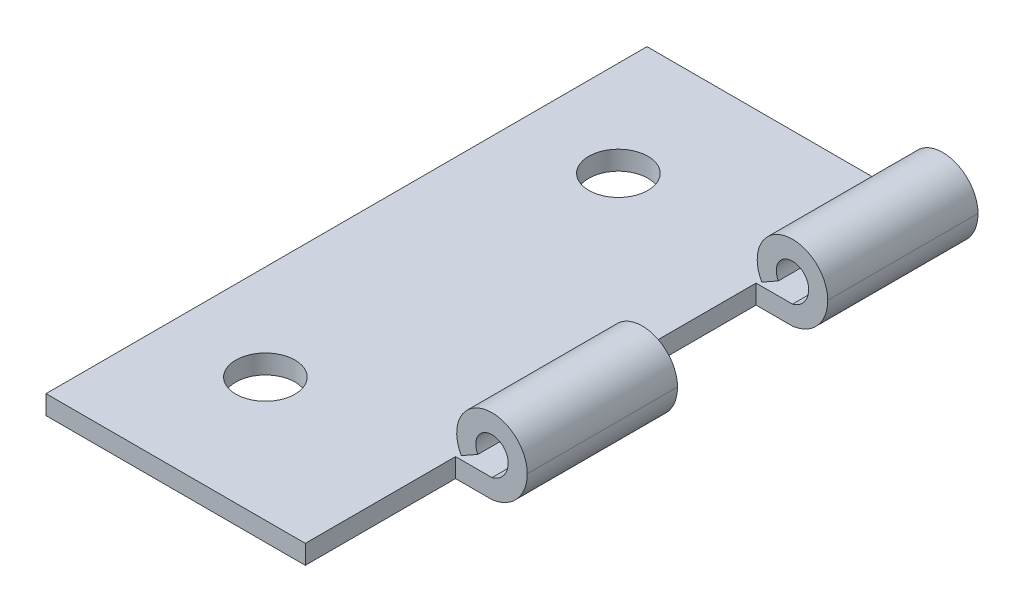
ISO-10303-21;
HEADER;
FILE_DESCRIPTION(('STEP AP214'),'2;1');
FILE_NAME('part.step','',(''),(''),'','','');
FILE_SCHEMA(('AUTOMOTIVE_DESIGN { 1 0 10303 214 1 1 1 1 }'));
ENDSEC;
DATA;
#1=APPLICATION_CONTEXT('core data for automotive mechanical design processes');
#2=APPLICATION_PROTOCOL_DEFINITION('international standard','automotive_design',2000,#1);
#3=PRODUCT_CONTEXT('',#1,'mechanical');
#4=PRODUCT('Part','Part','',(#3));
#5=PRODUCT_RELATED_PRODUCT_CATEGORY('part','',(#4));
#6=PRODUCT_DEFINITION_FORMATION('','',#4);
#7=PRODUCT_DEFINITION_CONTEXT('part definition',#1,'design');
#8=PRODUCT_DEFINITION('design','',#6,#7);
#9=PRODUCT_DEFINITION_SHAPE('','',#8);
#10=(LENGTH_UNIT() NAMED_UNIT(*) SI_UNIT(.MILLI.,.METRE.));
#11=(NAMED_UNIT(*) PLANE_ANGLE_UNIT() SI_UNIT($,.RADIAN.));
#12=(NAMED_UNIT(*) SI_UNIT($,.STERADIAN.) SOLID_ANGLE_UNIT());
#13=UNCERTAINTY_MEASURE_WITH_UNIT(LENGTH_MEASURE(1.E-05),#10,'distance_accuracy_value','');
#14=(GEOMETRIC_REPRESENTATION_CONTEXT(3) GLOBAL_UNCERTAINTY_ASSIGNED_CONTEXT((#13)) GLOBAL_UNIT_ASSIGNED_CONTEXT((#10,
#11,#12)) REPRESENTATION_CONTEXT('',''));
#15=CARTESIAN_POINT('',(0.,0.,0.));
#16=DIRECTION('',(0.,0.,1.));
#17=DIRECTION('',(1.,0.,0.));
#18=AXIS2_PLACEMENT_3D('',#15,#16,#17);
#19=CARTESIAN_POINT('',(0.,2.,-63.));
#20=DIRECTION('',(0.,1.,0.));
#21=DIRECTION('',(0.,0.,1.));
#22=AXIS2_PLACEMENT_3D('',#19,#20,#21);
#23=PLANE('',#22);
#24=DIRECTION('',(1.,0.,0.));
#25=VECTOR('',#24,1.);
#26=CARTESIAN_POINT('',(0.,2.,-31.5));
#27=LINE('',#26,#25);
#28=CARTESIAN_POINT('',(27.1812071452329,2.,-31.5));
#29=VERTEX_POINT('',#28);
#30=CARTESIAN_POINT('',(31.,2.,-31.5));
#31=VERTEX_POINT('',#30);
#32=EDGE_CURVE('E262',#29,#31,#27,.T.);
#33=ORIENTED_EDGE('',*,*,#32,.F.);
#34=DIRECTION('',(0.,0.,-1.));
#35=VECTOR('',#34,1.);
#36=CARTESIAN_POINT('',(27.1812071452329,2.,-63.));
#37=LINE('',#36,#35);
#38=CARTESIAN_POINT('',(27.1812071452329,2.,-47.25));
#39=VERTEX_POINT('',#38);
#40=EDGE_CURVE('E204',#29,#39,#37,.T.);
#41=ORIENTED_EDGE('',*,*,#40,.T.);
#42=DIRECTION('',(1.,0.,0.));
#43=VECTOR('',#42,1.);
#44=CARTESIAN_POINT('',(0.,2.,-47.25));
#45=LINE('',#44,#43);
#46=CARTESIAN_POINT('',(31.,2.,-47.25));
#47=VERTEX_POINT('',#46);
#48=EDGE_CURVE('E248',#39,#47,#45,.T.);
#49=ORIENTED_EDGE('',*,*,#48,.T.);
#50=DIRECTION('',(0.,0.,1.));
#51=VECTOR('',#50,1.);
#52=CARTESIAN_POINT('',(31.,2.,-63.));
#53=LINE('',#52,#51);
#54=CARTESIAN_POINT('',(31.,2.,-63.));
#55=VERTEX_POINT('',#54);
#56=EDGE_CURVE('E297',#55,#47,#53,.T.);
#57=ORIENTED_EDGE('',*,*,#56,.F.);
#58=DIRECTION('',(-1.,0.,0.));
#59=VECTOR('',#58,1.);
#60=CARTESIAN_POINT('',(28.0277819059056,2.,-63.));
#61=LINE('',#60,#59);
#62=CARTESIAN_POINT('',(0.,2.,-63.));
#63=VERTEX_POINT('',#62);
#64=EDGE_CURVE('E287',#55,#63,#61,.T.);
#65=ORIENTED_EDGE('',*,*,#64,.T.);
#66=DIRECTION('',(0.,0.,1.));
#67=VECTOR('',#66,1.);
#68=CARTESIAN_POINT('',(0.,2.,-63.));
#69=LINE('',#68,#67);
#70=CARTESIAN_POINT('',(0.,2.,0.));
#71=VERTEX_POINT('',#70);
#72=EDGE_CURVE('E192',#63,#71,#69,.T.);
#73=ORIENTED_EDGE('',*,*,#72,.T.);
#74=DIRECTION('',(-1.,0.,0.));
#75=VECTOR('',#74,1.);
#76=CARTESIAN_POINT('',(0.,2.,0.));
#77=LINE('',#76,#75);
#78=CARTESIAN_POINT('',(27.1812071452329,2.,0.));
#79=VERTEX_POINT('',#78);
#80=EDGE_CURVE('E269',#79,#71,#77,.T.);
#81=ORIENTED_EDGE('',*,*,#80,.F.);
#82=DIRECTION('',(0.,0.,-1.));
#83=VECTOR('',#82,1.);
#84=CARTESIAN_POINT('',(27.1812071452329,2.,-63.));
#85=LINE('',#84,#83);
#86=CARTESIAN_POINT('',(27.1812071452329,2.,-15.75));
#87=VERTEX_POINT('',#86);
#88=EDGE_CURVE('E64',#79,#87,#85,.T.);
#89=ORIENTED_EDGE('',*,*,#88,.T.);
#90=DIRECTION('',(1.,0.,0.));
#91=VECTOR('',#90,1.);
#92=CARTESIAN_POINT('',(0.,2.,-15.75));
#93=LINE('',#92,#91);
#94=CARTESIAN_POINT('',(31.,2.,-15.75));
#95=VERTEX_POINT('',#94);
#96=EDGE_CURVE('E179',#87,#95,#93,.T.);
#97=ORIENTED_EDGE('',*,*,#96,.T.);
#98=EDGE_CURVE('E300',#31,#95,#53,.T.);
#99=ORIENTED_EDGE('',*,*,#98,.F.);
#100=EDGE_LOOP('',(#33,#41,#49,#57,#65,#73,#81,#89,#97,#99));
#101=FACE_BOUND('',#100,.T.);
#102=CARTESIAN_POINT('',(10.0000000000004,2.,-13.));
#103=DIRECTION('',(0.,1.,0.));
#104=DIRECTION('',(0.,0.,1.));
#105=AXIS2_PLACEMENT_3D('',#102,#103,#104);
#106=CIRCLE('',#105,3.1);
#107=CARTESIAN_POINT('',(10.0000000000004,2.,-9.9));
#108=VERTEX_POINT('',#107);
#109=EDGE_CURVE('E215',#108,#108,#106,.T.);
#110=ORIENTED_EDGE('',*,*,#109,.F.);
#111=EDGE_LOOP('',(#110));
#112=FACE_BOUND('',#111,.T.);
#113=CARTESIAN_POINT('',(10.,2.,-50.));
#114=DIRECTION('',(0.,1.,0.));
#115=DIRECTION('',(0.,0.,1.));
#116=AXIS2_PLACEMENT_3D('',#113,#114,#115);
#117=CIRCLE('',#116,3.1);
#118=CARTESIAN_POINT('',(10.,2.,-46.9));
#119=VERTEX_POINT('',#118);
#120=EDGE_CURVE('E212',#119,#119,#117,.T.);
#121=ORIENTED_EDGE('',*,*,#120,.F.);
#122=EDGE_LOOP('',(#121));
#123=FACE_BOUND('',#122,.T.);
#124=ADVANCED_FACE('F41',(#101,#112,#123),#23,.T.);
#125=CARTESIAN_POINT('',(30.4235903862677,4.2,-63.));
#126=DIRECTION('',(0.,0.,1.));
#127=DIRECTION('',(1.,0.,0.));
#128=AXIS2_PLACEMENT_3D('',#125,#126,#127);
#129=CYLINDRICAL_SURFACE('',#128,2.27425769050102);
#130=ORIENTED_EDGE('',*,*,#56,.T.);
#131=CARTESIAN_POINT('',(30.4235903862677,4.2,-47.25));
#132=DIRECTION('',(0.,0.,1.));
#133=DIRECTION('',(1.,0.,0.));
#134=AXIS2_PLACEMENT_3D('',#131,#132,#133);
#135=CIRCLE('',#134,2.27425769050102);
#136=CARTESIAN_POINT('',(32.6978480767687,4.2,-47.25));
#137=VERTEX_POINT('',#136);
#138=EDGE_CURVE('E245',#47,#137,#135,.T.);
#139=ORIENTED_EDGE('',*,*,#138,.T.);
#140=DIRECTION('',(0.,0.,1.));
#141=VECTOR('',#140,1.);
#142=CARTESIAN_POINT('',(32.6978480767687,4.2,-63.));
#143=LINE('',#142,#141);
#144=CARTESIAN_POINT('',(32.6978480767687,4.2,-63.));
#145=VERTEX_POINT('',#144);
#146=EDGE_CURVE('E301',#145,#137,#143,.T.);
#147=ORIENTED_EDGE('',*,*,#146,.F.);
#148=CARTESIAN_POINT('',(30.4235903862677,4.2,-63.));
#149=DIRECTION('',(0.,0.,-1.));
#150=DIRECTION('',(-1.,0.,0.));
#151=AXIS2_PLACEMENT_3D('',#148,#149,#150);
#152=CIRCLE('',#151,2.27425769050102);
#153=EDGE_CURVE('E284',#145,#55,#152,.T.);
#154=ORIENTED_EDGE('',*,*,#153,.T.);
#155=EDGE_LOOP('',(#130,#139,#147,#154));
#156=FACE_BOUND('',#155,.T.);
#157=ADVANCED_FACE('F337',(#156),#129,.F.);
#158=CARTESIAN_POINT('',(30.4235903862677,4.2,-31.5));
#159=DIRECTION('',(0.,0.,1.));
#160=DIRECTION('',(1.,0.,0.));
#161=AXIS2_PLACEMENT_3D('',#158,#159,#160);
#162=CIRCLE('',#161,2.27425769050102);
#163=CARTESIAN_POINT('',(32.6978480767687,4.2,-31.5));
#164=VERTEX_POINT('',#163);
#165=EDGE_CURVE('E260',#31,#164,#162,.T.);
#166=ORIENTED_EDGE('',*,*,#165,.F.);
#167=ORIENTED_EDGE('',*,*,#98,.T.);
#168=CARTESIAN_POINT('',(30.4235903862677,4.2,-15.75));
#169=DIRECTION('',(0.,0.,1.));
#170=DIRECTION('',(1.,0.,0.));
#171=AXIS2_PLACEMENT_3D('',#168,#169,#170);
#172=CIRCLE('',#171,2.27425769050102);
#173=CARTESIAN_POINT('',(32.6978480767687,4.2,-15.75));
#174=VERTEX_POINT('',#173);
#175=EDGE_CURVE('E229',#95,#174,#172,.T.);
#176=ORIENTED_EDGE('',*,*,#175,.T.);
#177=EDGE_CURVE('E304',#164,#174,#143,.T.);
#178=ORIENTED_EDGE('',*,*,#177,.F.);
#179=EDGE_LOOP('',(#166,#167,#176,#178));
#180=FACE_BOUND('',#179,.T.);
#181=ADVANCED_FACE('F343',(#180),#129,.F.);
#182=CARTESIAN_POINT('',(31.,4.2,-63.));
#183=DIRECTION('',(0.,0.,1.));
#184=DIRECTION('',(1.,0.,0.));
#185=AXIS2_PLACEMENT_3D('',#182,#183,#184);
#186=CYLINDRICAL_SURFACE('',#185,1.69784807676871);
#187=ORIENTED_EDGE('',*,*,#146,.T.);
#188=CARTESIAN_POINT('',(31.,4.2,-47.25));
#189=DIRECTION('',(0.,0.,1.));
#190=DIRECTION('',(1.,0.,0.));
#191=AXIS2_PLACEMENT_3D('',#188,#189,#190);
#192=CIRCLE('',#191,1.69784807676871);
#193=CARTESIAN_POINT('',(29.5209961375877,3.36619206842535,-47.25));
#194=VERTEX_POINT('',#193);
#195=EDGE_CURVE('E242',#137,#194,#192,.T.);
#196=ORIENTED_EDGE('',*,*,#195,.T.);
#197=DIRECTION('',(0.,0.,1.));
#198=VECTOR('',#197,1.);
#199=CARTESIAN_POINT('',(29.5209961375877,3.36619206842535,-63.));
#200=LINE('',#199,#198);
#201=CARTESIAN_POINT('',(29.5209961375877,3.36619206842535,-63.));
#202=VERTEX_POINT('',#201);
#203=EDGE_CURVE('E305',#202,#194,#200,.T.);
#204=ORIENTED_EDGE('',*,*,#203,.F.);
#205=CARTESIAN_POINT('',(31.,4.2,-63.));
#206=DIRECTION('',(0.,0.,-1.));
#207=DIRECTION('',(1.,0.,0.));
#208=AXIS2_PLACEMENT_3D('',#205,#206,#207);
#209=CIRCLE('',#208,1.69784807676871);
#210=EDGE_CURVE('E281',#202,#145,#209,.T.);
#211=ORIENTED_EDGE('',*,*,#210,.T.);
#212=EDGE_LOOP('',(#187,#196,#204,#211));
#213=FACE_BOUND('',#212,.T.);
#214=ADVANCED_FACE('F349',(#213),#186,.F.);
#215=CARTESIAN_POINT('',(31.,4.2,-31.5));
#216=DIRECTION('',(0.,0.,1.));
#217=DIRECTION('',(1.,0.,0.));
#218=AXIS2_PLACEMENT_3D('',#215,#216,#217);
#219=CIRCLE('',#218,1.69784807676871);
#220=CARTESIAN_POINT('',(29.5209961375877,3.36619206842535,-31.5));
#221=VERTEX_POINT('',#220);
#222=EDGE_CURVE('E258',#164,#221,#219,.T.);
#223=ORIENTED_EDGE('',*,*,#222,.F.);
#224=ORIENTED_EDGE('',*,*,#177,.T.);
#225=CARTESIAN_POINT('',(31.,4.2,-15.75));
#226=DIRECTION('',(0.,0.,1.));
#227=DIRECTION('',(1.,0.,0.));
#228=AXIS2_PLACEMENT_3D('',#225,#226,#227);
#229=CIRCLE('',#228,1.69784807676871);
#230=CARTESIAN_POINT('',(29.5209961375877,3.36619206842535,-15.75));
#231=VERTEX_POINT('',#230);
#232=EDGE_CURVE('E226',#174,#231,#229,.T.);
#233=ORIENTED_EDGE('',*,*,#232,.T.);
#234=EDGE_CURVE('E308',#221,#231,#200,.T.);
#235=ORIENTED_EDGE('',*,*,#234,.F.);
#236=EDGE_LOOP('',(#223,#224,#233,#235));
#237=FACE_BOUND('',#236,.T.);
#238=ADVANCED_FACE('F352',(#237),#186,.F.);
#239=CARTESIAN_POINT('',(27.778786239483,2.38399826323929,-63.));
#240=DIRECTION('',(0.491096902593033,-0.871104949052368,0.));
#241=DIRECTION('',(0.871104949052368,0.491096902593033,0.));
#242=AXIS2_PLACEMENT_3D('',#239,#240,#241);
#243=PLANE('',#242);
#244=ORIENTED_EDGE('',*,*,#203,.T.);
#245=DIRECTION('',(-0.871104949052368,-0.491096902593033,0.));
#246=VECTOR('',#245,1.);
#247=CARTESIAN_POINT('',(27.778786239483,2.38399826323929,-47.25));
#248=LINE('',#247,#246);
#249=CARTESIAN_POINT('',(27.778786239483,2.38399826323928,-47.25));
#250=VERTEX_POINT('',#249);
#251=EDGE_CURVE('E239',#194,#250,#248,.T.);
#252=ORIENTED_EDGE('',*,*,#251,.T.);
#253=DIRECTION('',(0.,0.,1.));
#254=VECTOR('',#253,1.);
#255=CARTESIAN_POINT('',(27.778786239483,2.38399826323928,-63.));
#256=LINE('',#255,#254);
#257=CARTESIAN_POINT('',(27.778786239483,2.38399826323928,-63.));
#258=VERTEX_POINT('',#257);
#259=EDGE_CURVE('E309',#258,#250,#256,.T.);
#260=ORIENTED_EDGE('',*,*,#259,.F.);
#261=DIRECTION('',(0.871104949052368,0.491096902593033,0.));
#262=VECTOR('',#261,1.);
#263=CARTESIAN_POINT('',(27.778786239483,2.38399826323929,-63.));
#264=LINE('',#263,#262);
#265=EDGE_CURVE('E278',#258,#202,#264,.T.);
#266=ORIENTED_EDGE('',*,*,#265,.T.);
#267=EDGE_LOOP('',(#244,#252,#260,#266));
#268=FACE_BOUND('',#267,.T.);
#269=ADVANCED_FACE('F354',(#268),#243,.T.);
#270=DIRECTION('',(-0.871104949052368,-0.491096902593033,0.));
#271=VECTOR('',#270,1.);
#272=CARTESIAN_POINT('',(27.778786239483,2.38399826323929,-31.5));
#273=LINE('',#272,#271);
#274=CARTESIAN_POINT('',(27.778786239483,2.38399826323928,-31.5));
#275=VERTEX_POINT('',#274);
#276=EDGE_CURVE('E256',#221,#275,#273,.T.);
#277=ORIENTED_EDGE('',*,*,#276,.F.);
#278=ORIENTED_EDGE('',*,*,#234,.T.);
#279=DIRECTION('',(-0.871104949052368,-0.491096902593033,0.));
#280=VECTOR('',#279,1.);
#281=CARTESIAN_POINT('',(27.778786239483,2.38399826323929,-15.75));
#282=LINE('',#281,#280);
#283=CARTESIAN_POINT('',(27.778786239483,2.38399826323928,-15.75));
#284=VERTEX_POINT('',#283);
#285=EDGE_CURVE('E223',#231,#284,#282,.T.);
#286=ORIENTED_EDGE('',*,*,#285,.T.);
#287=EDGE_CURVE('E312',#275,#284,#256,.T.);
#288=ORIENTED_EDGE('',*,*,#287,.F.);
#289=EDGE_LOOP('',(#277,#278,#286,#288));
#290=FACE_BOUND('',#289,.T.);
#291=ADVANCED_FACE('F357',(#290),#243,.T.);
#292=CARTESIAN_POINT('',(31.,4.2,-63.));
#293=DIRECTION('',(0.,0.,1.));
#294=DIRECTION('',(1.,0.,0.));
#295=AXIS2_PLACEMENT_3D('',#292,#293,#294);
#296=CYLINDRICAL_SURFACE('',#295,3.69784807676871);
#297=ORIENTED_EDGE('',*,*,#259,.T.);
#298=CARTESIAN_POINT('',(31.,4.2,-47.25));
#299=DIRECTION('',(0.,0.,1.));
#300=DIRECTION('',(1.,0.,0.));
#301=AXIS2_PLACEMENT_3D('',#298,#299,#300);
#302=CIRCLE('',#301,3.69784807676871);
#303=CARTESIAN_POINT('',(34.6978480767687,4.2,-47.25));
#304=VERTEX_POINT('',#303);
#305=EDGE_CURVE('E236',#250,#304,#302,.F.);
#306=ORIENTED_EDGE('',*,*,#305,.T.);
#307=DIRECTION('',(0.,0.,1.));
#308=VECTOR('',#307,1.);
#309=CARTESIAN_POINT('',(34.6978480767687,4.2,-63.));
#310=LINE('',#309,#308);
#311=CARTESIAN_POINT('',(34.6978480767687,4.2,-63.));
#312=VERTEX_POINT('',#311);
#313=EDGE_CURVE('E313',#312,#304,#310,.T.);
#314=ORIENTED_EDGE('',*,*,#313,.F.);
#315=CARTESIAN_POINT('',(31.,4.2,-63.));
#316=DIRECTION('',(0.,0.,1.));
#317=DIRECTION('',(1.,0.,0.));
#318=AXIS2_PLACEMENT_3D('',#315,#316,#317);
#319=CIRCLE('',#318,3.69784807676871);
#320=EDGE_CURVE('E275',#312,#258,#319,.T.);
#321=ORIENTED_EDGE('',*,*,#320,.T.);
#322=EDGE_LOOP('',(#297,#306,#314,#321));
#323=FACE_BOUND('',#322,.T.);
#324=ADVANCED_FACE('F359',(#323),#296,.T.);
#325=CARTESIAN_POINT('',(31.,4.2,-31.5));
#326=DIRECTION('',(0.,0.,1.));
#327=DIRECTION('',(1.,0.,0.));
#328=AXIS2_PLACEMENT_3D('',#325,#326,#327);
#329=CIRCLE('',#328,3.69784807676871);
#330=CARTESIAN_POINT('',(34.6978480767687,4.2,-31.5));
#331=VERTEX_POINT('',#330);
#332=EDGE_CURVE('E254',#275,#331,#329,.F.);
#333=ORIENTED_EDGE('',*,*,#332,.F.);
#334=ORIENTED_EDGE('',*,*,#287,.T.);
#335=CARTESIAN_POINT('',(31.,4.2,-15.75));
#336=DIRECTION('',(0.,0.,1.));
#337=DIRECTION('',(1.,0.,0.));
#338=AXIS2_PLACEMENT_3D('',#335,#336,#337);
#339=CIRCLE('',#338,3.69784807676871);
#340=CARTESIAN_POINT('',(34.6978480767687,4.2,-15.75));
#341=VERTEX_POINT('',#340);
#342=EDGE_CURVE('E220',#284,#341,#339,.F.);
#343=ORIENTED_EDGE('',*,*,#342,.T.);
#344=EDGE_CURVE('E316',#331,#341,#310,.T.);
#345=ORIENTED_EDGE('',*,*,#344,.F.);
#346=EDGE_LOOP('',(#333,#334,#343,#345));
#347=FACE_BOUND('',#346,.T.);
#348=ADVANCED_FACE('F361',(#347),#296,.T.);
#349=CARTESIAN_POINT('',(30.4637530370632,4.2,-63.));
#350=DIRECTION('',(0.,0.,1.));
#351=DIRECTION('',(1.,0.,0.));
#352=AXIS2_PLACEMENT_3D('',#349,#350,#351);
#353=CYLINDRICAL_SURFACE('',#352,4.23409503970553);
#354=ORIENTED_EDGE('',*,*,#313,.T.);
#355=CARTESIAN_POINT('',(30.4637530370632,4.2,-47.25));
#356=DIRECTION('',(0.,0.,1.));
#357=DIRECTION('',(1.,0.,0.));
#358=AXIS2_PLACEMENT_3D('',#355,#356,#357);
#359=CIRCLE('',#358,4.23409503970553);
#360=CARTESIAN_POINT('',(31.,0.,-47.25));
#361=VERTEX_POINT('',#360);
#362=EDGE_CURVE('E233',#304,#361,#359,.F.);
#363=ORIENTED_EDGE('',*,*,#362,.T.);
#364=DIRECTION('',(0.,0.,1.));
#365=VECTOR('',#364,1.);
#366=CARTESIAN_POINT('',(31.,0.,-63.));
#367=LINE('',#366,#365);
#368=CARTESIAN_POINT('',(31.,0.,-63.));
#369=VERTEX_POINT('',#368);
#370=EDGE_CURVE('E317',#369,#361,#367,.T.);
#371=ORIENTED_EDGE('',*,*,#370,.F.);
#372=CARTESIAN_POINT('',(30.4637530370632,4.2,-63.));
#373=DIRECTION('',(0.,0.,1.));
#374=DIRECTION('',(-1.,0.,0.));
#375=AXIS2_PLACEMENT_3D('',#372,#373,#374);
#376=CIRCLE('',#375,4.23409503970553);
#377=EDGE_CURVE('E272',#369,#312,#376,.T.);
#378=ORIENTED_EDGE('',*,*,#377,.T.);
#379=EDGE_LOOP('',(#354,#363,#371,#378));
#380=FACE_BOUND('',#379,.T.);
#381=ADVANCED_FACE('F333',(#380),#353,.T.);
#382=CARTESIAN_POINT('',(30.4637530370632,4.2,-31.5));
#383=DIRECTION('',(0.,0.,1.));
#384=DIRECTION('',(1.,0.,0.));
#385=AXIS2_PLACEMENT_3D('',#382,#383,#384);
#386=CIRCLE('',#385,4.23409503970553);
#387=CARTESIAN_POINT('',(31.,0.,-31.5));
#388=VERTEX_POINT('',#387);
#389=EDGE_CURVE('E252',#331,#388,#386,.F.);
#390=ORIENTED_EDGE('',*,*,#389,.F.);
#391=ORIENTED_EDGE('',*,*,#344,.T.);
#392=CARTESIAN_POINT('',(30.4637530370632,4.2,-15.75));
#393=DIRECTION('',(0.,0.,1.));
#394=DIRECTION('',(1.,0.,0.));
#395=AXIS2_PLACEMENT_3D('',#392,#393,#394);
#396=CIRCLE('',#395,4.23409503970553);
#397=CARTESIAN_POINT('',(31.,0.,-15.75));
#398=VERTEX_POINT('',#397);
#399=EDGE_CURVE('E218',#341,#398,#396,.F.);
#400=ORIENTED_EDGE('',*,*,#399,.T.);
#401=EDGE_CURVE('E187',#388,#398,#367,.T.);
#402=ORIENTED_EDGE('',*,*,#401,.F.);
#403=EDGE_LOOP('',(#390,#391,#400,#402));
#404=FACE_BOUND('',#403,.T.);
#405=ADVANCED_FACE('F326',(#404),#353,.T.);
#406=CARTESIAN_POINT('',(0.,0.,-63.));
#407=DIRECTION('',(0.,-1.,0.));
#408=DIRECTION('',(0.,0.,-1.));
#409=AXIS2_PLACEMENT_3D('',#406,#407,#408);
#410=PLANE('',#409);
#411=DIRECTION('',(-1.,0.,0.));
#412=VECTOR('',#411,1.);
#413=CARTESIAN_POINT('',(0.,0.,-31.5));
#414=LINE('',#413,#412);
#415=CARTESIAN_POINT('',(27.1812071452329,0.,-31.5));
#416=VERTEX_POINT('',#415);
#417=EDGE_CURVE('E11',#388,#416,#414,.T.);
#418=ORIENTED_EDGE('',*,*,#417,.F.);
#419=ORIENTED_EDGE('',*,*,#401,.T.);
#420=DIRECTION('',(-1.,0.,0.));
#421=VECTOR('',#420,1.);
#422=CARTESIAN_POINT('',(0.,0.,-15.75));
#423=LINE('',#422,#421);
#424=CARTESIAN_POINT('',(27.1812071452329,0.,-15.75));
#425=VERTEX_POINT('',#424);
#426=EDGE_CURVE('E176',#398,#425,#423,.T.);
#427=ORIENTED_EDGE('',*,*,#426,.T.);
#428=DIRECTION('',(0.,0.,1.));
#429=VECTOR('',#428,1.);
#430=CARTESIAN_POINT('',(27.1812071452329,0.,-63.));
#431=LINE('',#430,#429);
#432=CARTESIAN_POINT('',(27.1812071452329,0.,0.));
#433=VERTEX_POINT('',#432);
#434=EDGE_CURVE('E164',#425,#433,#431,.T.);
#435=ORIENTED_EDGE('',*,*,#434,.T.);
#436=DIRECTION('',(1.,0.,0.));
#437=VECTOR('',#436,1.);
#438=CARTESIAN_POINT('',(0.,0.,0.));
#439=LINE('',#438,#437);
#440=CARTESIAN_POINT('',(0.,0.,0.));
#441=VERTEX_POINT('',#440);
#442=EDGE_CURVE('E292',#441,#433,#439,.T.);
#443=ORIENTED_EDGE('',*,*,#442,.F.);
#444=DIRECTION('',(0.,0.,1.));
#445=VECTOR('',#444,1.);
#446=CARTESIAN_POINT('',(0.,0.,-63.));
#447=LINE('',#446,#445);
#448=CARTESIAN_POINT('',(0.,0.,-63.));
#449=VERTEX_POINT('',#448);
#450=EDGE_CURVE('E289',#449,#441,#447,.T.);
#451=ORIENTED_EDGE('',*,*,#450,.F.);
#452=DIRECTION('',(1.,0.,0.));
#453=VECTOR('',#452,1.);
#454=CARTESIAN_POINT('',(0.,0.,-63.));
#455=LINE('',#454,#453);
#456=EDGE_CURVE('E268',#449,#369,#455,.T.);
#457=ORIENTED_EDGE('',*,*,#456,.T.);
#458=ORIENTED_EDGE('',*,*,#370,.T.);
#459=DIRECTION('',(-1.,0.,0.));
#460=VECTOR('',#459,1.);
#461=CARTESIAN_POINT('',(0.,0.,-47.25));
#462=LINE('',#461,#460);
#463=CARTESIAN_POINT('',(27.1812071452329,0.,-47.25));
#464=VERTEX_POINT('',#463);
#465=EDGE_CURVE('E188',#361,#464,#462,.T.);
#466=ORIENTED_EDGE('',*,*,#465,.T.);
#467=DIRECTION('',(0.,0.,1.));
#468=VECTOR('',#467,1.);
#469=CARTESIAN_POINT('',(27.1812071452329,0.,-63.));
#470=LINE('',#469,#468);
#471=EDGE_CURVE('E49',#464,#416,#470,.T.);
#472=ORIENTED_EDGE('',*,*,#471,.T.);
#473=EDGE_LOOP('',(#418,#419,#427,#435,#443,#451,#457,#458,#466,#472));
#474=FACE_BOUND('',#473,.T.);
#475=CARTESIAN_POINT('',(10.0000000000004,0.,-13.));
#476=DIRECTION('',(0.,-1.,0.));
#477=DIRECTION('',(0.,0.,-1.));
#478=AXIS2_PLACEMENT_3D('',#475,#476,#477);
#479=CIRCLE('',#478,3.1);
#480=CARTESIAN_POINT('',(10.0000000000004,0.,-16.1));
#481=VERTEX_POINT('',#480);
#482=EDGE_CURVE('E195',#481,#481,#479,.T.);
#483=ORIENTED_EDGE('',*,*,#482,.F.);
#484=EDGE_LOOP('',(#483));
#485=FACE_BOUND('',#484,.T.);
#486=CARTESIAN_POINT('',(10.,0.,-50.));
#487=DIRECTION('',(0.,-1.,0.));
#488=DIRECTION('',(0.,0.,-1.));
#489=AXIS2_PLACEMENT_3D('',#486,#487,#488);
#490=CIRCLE('',#489,3.1);
#491=CARTESIAN_POINT('',(10.,0.,-53.1));
#492=VERTEX_POINT('',#491);
#493=EDGE_CURVE('E211',#492,#492,#490,.T.);
#494=ORIENTED_EDGE('',*,*,#493,.F.);
#495=EDGE_LOOP('',(#494));
#496=FACE_BOUND('',#495,.T.);
#497=ADVANCED_FACE('F184',(#474,#485,#496),#410,.T.);
#498=CARTESIAN_POINT('',(30.4235903862677,4.2,0.));
#499=DIRECTION('',(0.,0.,-1.));
#500=DIRECTION('',(-1.,0.,0.));
#501=AXIS2_PLACEMENT_3D('',#498,#499,#500);
#502=PLANE('',#501);
#503=DIRECTION('',(0.,-1.,0.));
#504=VECTOR('',#503,1.);
#505=CARTESIAN_POINT('',(27.1812071452329,4.2,0.));
#506=LINE('',#505,#504);
#507=EDGE_CURVE('E168',#79,#433,#506,.T.);
#508=ORIENTED_EDGE('',*,*,#507,.F.);
#509=ORIENTED_EDGE('',*,*,#80,.T.);
#510=DIRECTION('',(0.,-1.,0.));
#511=VECTOR('',#510,1.);
#512=CARTESIAN_POINT('',(0.,0.,0.));
#513=LINE('',#512,#511);
#514=EDGE_CURVE('E264',#71,#441,#513,.T.);
#515=ORIENTED_EDGE('',*,*,#514,.T.);
#516=ORIENTED_EDGE('',*,*,#442,.T.);
#517=EDGE_LOOP('',(#508,#509,#515,#516));
#518=FACE_BOUND('',#517,.T.);
#519=ADVANCED_FACE('F325',(#518),#502,.F.);
#520=CARTESIAN_POINT('',(0.,0.,-63.));
#521=DIRECTION('',(-1.,0.,0.));
#522=DIRECTION('',(0.,0.,1.));
#523=AXIS2_PLACEMENT_3D('',#520,#521,#522);
#524=PLANE('',#523);
#525=ORIENTED_EDGE('',*,*,#514,.F.);
#526=ORIENTED_EDGE('',*,*,#72,.F.);
#527=DIRECTION('',(0.,-1.,0.));
#528=VECTOR('',#527,1.);
#529=CARTESIAN_POINT('',(0.,0.,-63.));
#530=LINE('',#529,#528);
#531=EDGE_CURVE('E265',#63,#449,#530,.T.);
#532=ORIENTED_EDGE('',*,*,#531,.T.);
#533=ORIENTED_EDGE('',*,*,#450,.T.);
#534=EDGE_LOOP('',(#525,#526,#532,#533));
#535=FACE_BOUND('',#534,.T.);
#536=ADVANCED_FACE('F43',(#535),#524,.T.);
#537=CARTESIAN_POINT('',(30.4235903862677,4.2,-63.));
#538=DIRECTION('',(0.,0.,-1.));
#539=DIRECTION('',(-1.,0.,0.));
#540=AXIS2_PLACEMENT_3D('',#537,#538,#539);
#541=PLANE('',#540);
#542=ORIENTED_EDGE('',*,*,#531,.F.);
#543=ORIENTED_EDGE('',*,*,#64,.F.);
#544=ORIENTED_EDGE('',*,*,#153,.F.);
#545=ORIENTED_EDGE('',*,*,#210,.F.);
#546=ORIENTED_EDGE('',*,*,#265,.F.);
#547=ORIENTED_EDGE('',*,*,#320,.F.);
#548=ORIENTED_EDGE('',*,*,#377,.F.);
#549=ORIENTED_EDGE('',*,*,#456,.F.);
#550=EDGE_LOOP('',(#542,#543,#544,#545,#546,#547,#548,#549));
#551=FACE_BOUND('',#550,.T.);
#552=ADVANCED_FACE('F374',(#551),#541,.T.);
#553=CARTESIAN_POINT('',(27.1812071452329,-51.,0.));
#554=DIRECTION('',(1.,0.,0.));
#555=DIRECTION('',(0.,0.,-1.));
#556=AXIS2_PLACEMENT_3D('',#553,#554,#555);
#557=PLANE('',#556);
#558=ORIENTED_EDGE('',*,*,#507,.T.);
#559=ORIENTED_EDGE('',*,*,#434,.F.);
#560=DIRECTION('',(0.,1.,0.));
#561=VECTOR('',#560,1.);
#562=CARTESIAN_POINT('',(27.1812071452329,-51.,-15.75));
#563=LINE('',#562,#561);
#564=EDGE_CURVE('E167',#425,#87,#563,.T.);
#565=ORIENTED_EDGE('',*,*,#564,.T.);
#566=ORIENTED_EDGE('',*,*,#88,.F.);
#567=EDGE_LOOP('',(#558,#559,#565,#566));
#568=FACE_BOUND('',#567,.T.);
#569=ADVANCED_FACE('F166',(#568),#557,.T.);
#570=CARTESIAN_POINT('',(0.,-51.,-15.75));
#571=DIRECTION('',(0.,0.,1.));
#572=DIRECTION('',(1.,0.,0.));
#573=AXIS2_PLACEMENT_3D('',#570,#571,#572);
#574=PLANE('',#573);
#575=ORIENTED_EDGE('',*,*,#564,.F.);
#576=ORIENTED_EDGE('',*,*,#426,.F.);
#577=ORIENTED_EDGE('',*,*,#399,.F.);
#578=ORIENTED_EDGE('',*,*,#342,.F.);
#579=ORIENTED_EDGE('',*,*,#285,.F.);
#580=ORIENTED_EDGE('',*,*,#232,.F.);
#581=ORIENTED_EDGE('',*,*,#175,.F.);
#582=ORIENTED_EDGE('',*,*,#96,.F.);
#583=EDGE_LOOP('',(#575,#576,#577,#578,#579,#580,#581,#582));
#584=FACE_BOUND('',#583,.T.);
#585=ADVANCED_FACE('F175',(#584),#574,.T.);
#586=CARTESIAN_POINT('',(10.,-51.,-50.));
#587=DIRECTION('',(0.,1.,0.));
#588=DIRECTION('',(0.,0.,1.));
#589=AXIS2_PLACEMENT_3D('',#586,#587,#588);
#590=CYLINDRICAL_SURFACE('',#589,3.1);
#591=ORIENTED_EDGE('',*,*,#120,.T.);
#592=EDGE_LOOP('',(#591));
#593=FACE_BOUND('',#592,.T.);
#594=ORIENTED_EDGE('',*,*,#493,.T.);
#595=EDGE_LOOP('',(#594));
#596=FACE_BOUND('',#595,.T.);
#597=ADVANCED_FACE('F322',(#593,#596),#590,.F.);
#598=CARTESIAN_POINT('',(10.0000000000004,-51.,-13.));
#599=DIRECTION('',(0.,1.,0.));
#600=DIRECTION('',(0.,0.,1.));
#601=AXIS2_PLACEMENT_3D('',#598,#599,#600);
#602=CYLINDRICAL_SURFACE('',#601,3.1);
#603=ORIENTED_EDGE('',*,*,#109,.T.);
#604=EDGE_LOOP('',(#603));
#605=FACE_BOUND('',#604,.T.);
#606=ORIENTED_EDGE('',*,*,#482,.T.);
#607=EDGE_LOOP('',(#606));
#608=FACE_BOUND('',#607,.T.);
#609=ADVANCED_FACE('F466',(#605,#608),#602,.F.);
#610=CARTESIAN_POINT('',(0.,-51.,-31.5));
#611=DIRECTION('',(0.,0.,1.));
#612=DIRECTION('',(1.,0.,0.));
#613=AXIS2_PLACEMENT_3D('',#610,#611,#612);
#614=PLANE('',#613);
#615=ORIENTED_EDGE('',*,*,#32,.T.);
#616=ORIENTED_EDGE('',*,*,#165,.T.);
#617=ORIENTED_EDGE('',*,*,#222,.T.);
#618=ORIENTED_EDGE('',*,*,#276,.T.);
#619=ORIENTED_EDGE('',*,*,#332,.T.);
#620=ORIENTED_EDGE('',*,*,#389,.T.);
#621=ORIENTED_EDGE('',*,*,#417,.T.);
#622=DIRECTION('',(0.,1.,0.));
#623=VECTOR('',#622,1.);
#624=CARTESIAN_POINT('',(27.1812071452329,-51.,-31.5));
#625=LINE('',#624,#623);
#626=EDGE_CURVE('E180',#416,#29,#625,.T.);
#627=ORIENTED_EDGE('',*,*,#626,.T.);
#628=EDGE_LOOP('',(#615,#616,#617,#618,#619,#620,#621,#627));
#629=FACE_BOUND('',#628,.T.);
#630=ADVANCED_FACE('F391',(#629),#614,.F.);
#631=CARTESIAN_POINT('',(27.1812071452329,-51.,0.));
#632=DIRECTION('',(1.,0.,0.));
#633=DIRECTION('',(0.,0.,-1.));
#634=AXIS2_PLACEMENT_3D('',#631,#632,#633);
#635=PLANE('',#634);
#636=ORIENTED_EDGE('',*,*,#626,.F.);
#637=ORIENTED_EDGE('',*,*,#471,.F.);
#638=DIRECTION('',(0.,1.,0.));
#639=VECTOR('',#638,1.);
#640=CARTESIAN_POINT('',(27.1812071452329,-51.,-47.25));
#641=LINE('',#640,#639);
#642=EDGE_CURVE('E56',#464,#39,#641,.T.);
#643=ORIENTED_EDGE('',*,*,#642,.T.);
#644=ORIENTED_EDGE('',*,*,#40,.F.);
#645=EDGE_LOOP('',(#636,#637,#643,#644));
#646=FACE_BOUND('',#645,.T.);
#647=ADVANCED_FACE('F201',(#646),#635,.T.);
#648=CARTESIAN_POINT('',(0.,-51.,-47.25));
#649=DIRECTION('',(0.,0.,1.));
#650=DIRECTION('',(1.,0.,0.));
#651=AXIS2_PLACEMENT_3D('',#648,#649,#650);
#652=PLANE('',#651);
#653=ORIENTED_EDGE('',*,*,#642,.F.);
#654=ORIENTED_EDGE('',*,*,#465,.F.);
#655=ORIENTED_EDGE('',*,*,#362,.F.);
#656=ORIENTED_EDGE('',*,*,#305,.F.);
#657=ORIENTED_EDGE('',*,*,#251,.F.);
#658=ORIENTED_EDGE('',*,*,#195,.F.);
#659=ORIENTED_EDGE('',*,*,#138,.F.);
#660=ORIENTED_EDGE('',*,*,#48,.F.);
#661=EDGE_LOOP('',(#653,#654,#655,#656,#657,#658,#659,#660));
#662=FACE_BOUND('',#661,.T.);
#663=ADVANCED_FACE('F378',(#662),#652,.T.);
#664=CLOSED_SHELL('',(#124,#157,#181,#214,#238,#269,#291,#324,#348,#381,#405,#497,#519,#536,
#552,#569,#585,#597,#609,#630,#647,#663));
#665=MANIFOLD_SOLID_BREP('B2',#664);
#666=ADVANCED_BREP_SHAPE_REPRESENTATION('',(#18,#665),#14);
#667=SHAPE_DEFINITION_REPRESENTATION(#9,#666);
ENDSEC;
END-ISO-10303-21;
